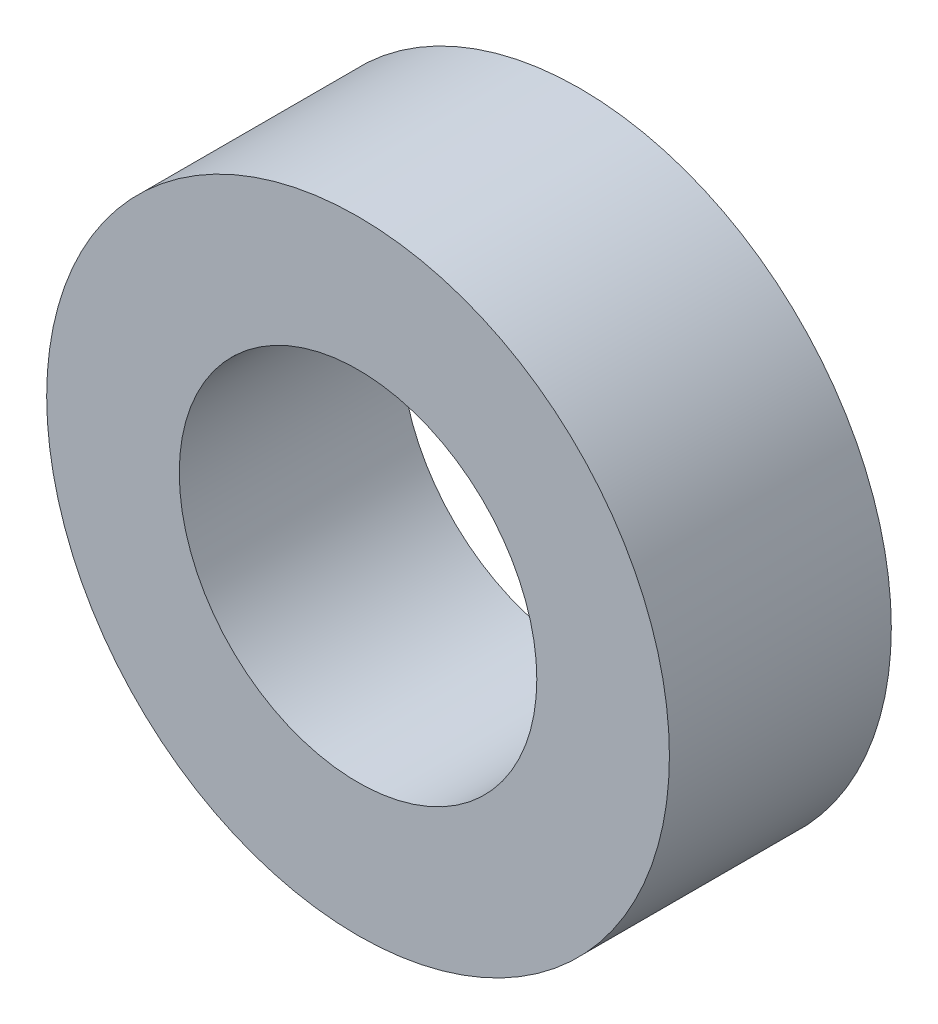
ISO-10303-21;
HEADER;
FILE_DESCRIPTION(('STEP AP214'),'2;1');
FILE_NAME('part.step','',(''),(''),'','','');
FILE_SCHEMA(('AUTOMOTIVE_DESIGN { 1 0 10303 214 1 1 1 1 }'));
ENDSEC;
DATA;
#1=APPLICATION_CONTEXT('core data for automotive mechanical design processes');
#2=APPLICATION_PROTOCOL_DEFINITION('international standard','automotive_design',2000,#1);
#3=PRODUCT_CONTEXT('',#1,'mechanical');
#4=PRODUCT('Part','Part','',(#3));
#5=PRODUCT_RELATED_PRODUCT_CATEGORY('part','',(#4));
#6=PRODUCT_DEFINITION_FORMATION('','',#4);
#7=PRODUCT_DEFINITION_CONTEXT('part definition',#1,'design');
#8=PRODUCT_DEFINITION('design','',#6,#7);
#9=PRODUCT_DEFINITION_SHAPE('','',#8);
#10=(LENGTH_UNIT() NAMED_UNIT(*) SI_UNIT(.MILLI.,.METRE.));
#11=(NAMED_UNIT(*) PLANE_ANGLE_UNIT() SI_UNIT($,.RADIAN.));
#12=(NAMED_UNIT(*) SI_UNIT($,.STERADIAN.) SOLID_ANGLE_UNIT());
#13=UNCERTAINTY_MEASURE_WITH_UNIT(LENGTH_MEASURE(1.E-05),#10,'distance_accuracy_value','');
#14=(GEOMETRIC_REPRESENTATION_CONTEXT(3) GLOBAL_UNCERTAINTY_ASSIGNED_CONTEXT((#13)) GLOBAL_UNIT_ASSIGNED_CONTEXT((#10,
#11,#12)) REPRESENTATION_CONTEXT('',''));
#15=CARTESIAN_POINT('',(0.,0.,0.));
#16=DIRECTION('',(0.,0.,1.));
#17=DIRECTION('',(1.,0.,0.));
#18=AXIS2_PLACEMENT_3D('',#15,#16,#17);
#19=CARTESIAN_POINT('',(0.,0.,8.128));
#20=DIRECTION('',(0.,0.,1.));
#21=DIRECTION('',(1.,0.,0.));
#22=AXIS2_PLACEMENT_3D('',#19,#20,#21);
#23=PLANE('',#22);
#24=CARTESIAN_POINT('',(0.,0.,8.128));
#25=DIRECTION('',(0.,0.,1.));
#26=DIRECTION('',(1.,0.,0.));
#27=AXIS2_PLACEMENT_3D('',#24,#25,#26);
#28=CIRCLE('',#27,11.4046);
#29=CARTESIAN_POINT('',(11.4046,0.,8.128));
#30=VERTEX_POINT('',#29);
#31=EDGE_CURVE('E10',#30,#30,#28,.T.);
#32=ORIENTED_EDGE('',*,*,#31,.T.);
#33=EDGE_LOOP('',(#32));
#34=FACE_BOUND('',#33,.T.);
#35=CARTESIAN_POINT('',(0.,0.,8.128));
#36=DIRECTION('',(0.,0.,1.));
#37=DIRECTION('',(1.,0.,0.));
#38=AXIS2_PLACEMENT_3D('',#35,#36,#37);
#39=CIRCLE('',#38,6.54812);
#40=CARTESIAN_POINT('',(6.54812,0.,8.128));
#41=VERTEX_POINT('',#40);
#42=EDGE_CURVE('E44',#41,#41,#39,.T.);
#43=ORIENTED_EDGE('',*,*,#42,.F.);
#44=EDGE_LOOP('',(#43));
#45=FACE_BOUND('',#44,.T.);
#46=ADVANCED_FACE('F33',(#34,#45),#23,.T.);
#47=CARTESIAN_POINT('',(0.,0.,0.));
#48=DIRECTION('',(0.,0.,1.));
#49=DIRECTION('',(1.,0.,0.));
#50=AXIS2_PLACEMENT_3D('',#47,#48,#49);
#51=PLANE('',#50);
#52=CARTESIAN_POINT('',(0.,0.,0.));
#53=DIRECTION('',(0.,0.,1.));
#54=DIRECTION('',(1.,0.,0.));
#55=AXIS2_PLACEMENT_3D('',#52,#53,#54);
#56=CIRCLE('',#55,11.4046);
#57=CARTESIAN_POINT('',(11.4046,0.,0.));
#58=VERTEX_POINT('',#57);
#59=EDGE_CURVE('E37',#58,#58,#56,.T.);
#60=ORIENTED_EDGE('',*,*,#59,.F.);
#61=EDGE_LOOP('',(#60));
#62=FACE_BOUND('',#61,.T.);
#63=CARTESIAN_POINT('',(0.,0.,0.));
#64=DIRECTION('',(0.,0.,1.));
#65=DIRECTION('',(1.,0.,0.));
#66=AXIS2_PLACEMENT_3D('',#63,#64,#65);
#67=CIRCLE('',#66,6.54812);
#68=CARTESIAN_POINT('',(6.54812,0.,0.));
#69=VERTEX_POINT('',#68);
#70=EDGE_CURVE('E46',#69,#69,#67,.T.);
#71=ORIENTED_EDGE('',*,*,#70,.T.);
#72=EDGE_LOOP('',(#71));
#73=FACE_BOUND('',#72,.T.);
#74=ADVANCED_FACE('F56',(#62,#73),#51,.F.);
#75=CARTESIAN_POINT('',(0.,0.,8.128));
#76=DIRECTION('',(0.,0.,-1.));
#77=DIRECTION('',(-1.,0.,0.));
#78=AXIS2_PLACEMENT_3D('',#75,#76,#77);
#79=CYLINDRICAL_SURFACE('',#78,11.4046);
#80=ORIENTED_EDGE('',*,*,#31,.F.);
#81=EDGE_LOOP('',(#80));
#82=FACE_BOUND('',#81,.T.);
#83=ORIENTED_EDGE('',*,*,#59,.T.);
#84=EDGE_LOOP('',(#83));
#85=FACE_BOUND('',#84,.T.);
#86=ADVANCED_FACE('F35',(#82,#85),#79,.T.);
#87=CARTESIAN_POINT('',(0.,0.,8.128));
#88=DIRECTION('',(0.,0.,-1.));
#89=DIRECTION('',(-1.,0.,0.));
#90=AXIS2_PLACEMENT_3D('',#87,#88,#89);
#91=CYLINDRICAL_SURFACE('',#90,6.54812);
#92=ORIENTED_EDGE('',*,*,#42,.T.);
#93=EDGE_LOOP('',(#92));
#94=FACE_BOUND('',#93,.T.);
#95=ORIENTED_EDGE('',*,*,#70,.F.);
#96=EDGE_LOOP('',(#95));
#97=FACE_BOUND('',#96,.T.);
#98=ADVANCED_FACE('F52',(#94,#97),#91,.F.);
#99=CLOSED_SHELL('',(#46,#74,#86,#98));
#100=MANIFOLD_SOLID_BREP('B2',#99);
#101=ADVANCED_BREP_SHAPE_REPRESENTATION('',(#18,#100),#14);
#102=SHAPE_DEFINITION_REPRESENTATION(#9,#101);
ENDSEC;
END-ISO-10303-21;
